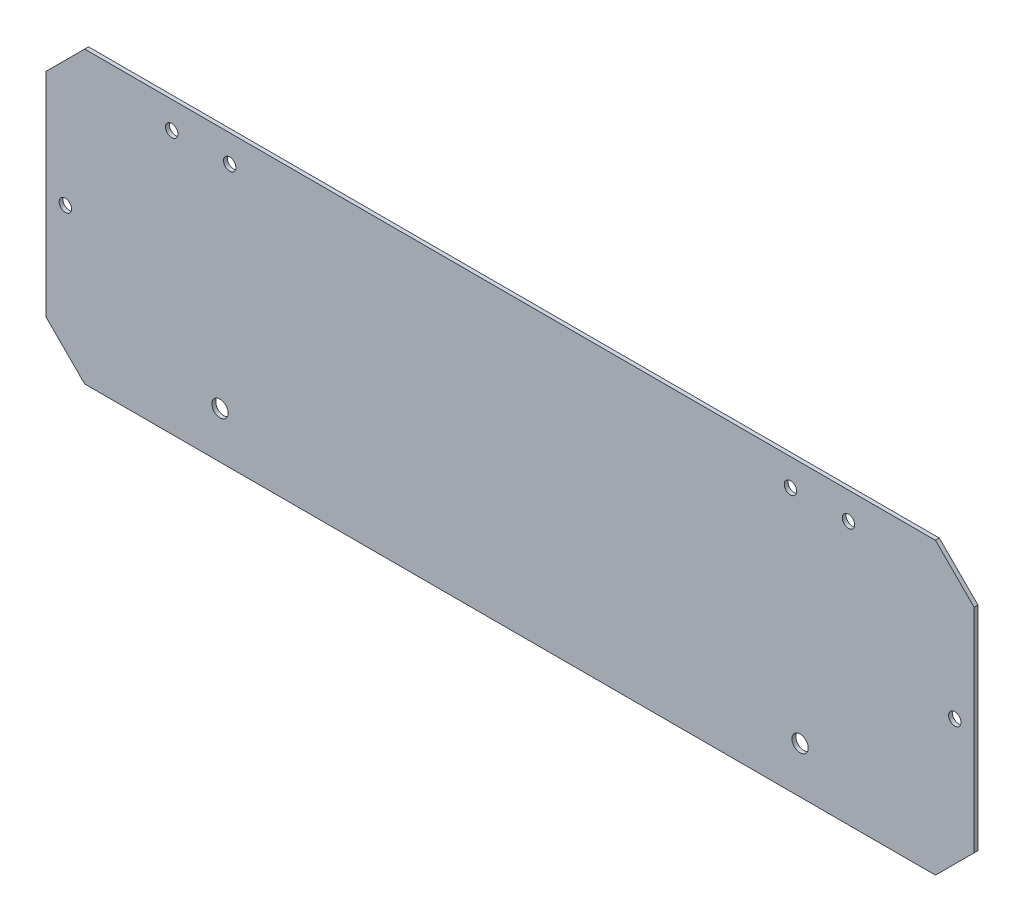
ISO-10303-21;
HEADER;
FILE_DESCRIPTION(('STEP AP214'),'2;1');
FILE_NAME('part.step','',(''),(''),'','','');
FILE_SCHEMA(('AUTOMOTIVE_DESIGN { 1 0 10303 214 1 1 1 1 }'));
ENDSEC;
DATA;
#1=APPLICATION_CONTEXT('core data for automotive mechanical design processes');
#2=APPLICATION_PROTOCOL_DEFINITION('international standard','automotive_design',2000,#1);
#3=PRODUCT_CONTEXT('',#1,'mechanical');
#4=PRODUCT('Part','Part','',(#3));
#5=PRODUCT_RELATED_PRODUCT_CATEGORY('part','',(#4));
#6=PRODUCT_DEFINITION_FORMATION('','',#4);
#7=PRODUCT_DEFINITION_CONTEXT('part definition',#1,'design');
#8=PRODUCT_DEFINITION('design','',#6,#7);
#9=PRODUCT_DEFINITION_SHAPE('','',#8);
#10=(LENGTH_UNIT() NAMED_UNIT(*) SI_UNIT(.MILLI.,.METRE.));
#11=(NAMED_UNIT(*) PLANE_ANGLE_UNIT() SI_UNIT($,.RADIAN.));
#12=(NAMED_UNIT(*) SI_UNIT($,.STERADIAN.) SOLID_ANGLE_UNIT());
#13=UNCERTAINTY_MEASURE_WITH_UNIT(LENGTH_MEASURE(1.E-05),#10,'distance_accuracy_value','');
#14=(GEOMETRIC_REPRESENTATION_CONTEXT(3) GLOBAL_UNCERTAINTY_ASSIGNED_CONTEXT((#13)) GLOBAL_UNIT_ASSIGNED_CONTEXT((#10,
#11,#12)) REPRESENTATION_CONTEXT('',''));
#15=CARTESIAN_POINT('',(0.,0.,0.));
#16=DIRECTION('',(0.,0.,1.));
#17=DIRECTION('',(1.,0.,0.));
#18=AXIS2_PLACEMENT_3D('',#15,#16,#17);
#19=CARTESIAN_POINT('',(0.,0.,1.));
#20=DIRECTION('',(1.,0.,0.));
#21=DIRECTION('',(0.,0.,-1.));
#22=AXIS2_PLACEMENT_3D('',#19,#20,#21);
#23=PLANE('',#22);
#24=DIRECTION('',(0.,-1.,0.));
#25=VECTOR('',#24,1.);
#26=CARTESIAN_POINT('',(0.,0.,0.));
#27=LINE('',#26,#25);
#28=CARTESIAN_POINT('',(0.,65.,0.));
#29=VERTEX_POINT('',#28);
#30=CARTESIAN_POINT('',(0.,10.,0.));
#31=VERTEX_POINT('',#30);
#32=EDGE_CURVE('E200',#29,#31,#27,.T.);
#33=ORIENTED_EDGE('',*,*,#32,.T.);
#34=DIRECTION('',(0.,0.,1.));
#35=VECTOR('',#34,1.);
#36=CARTESIAN_POINT('',(0.,10.,1.));
#37=LINE('',#36,#35);
#38=CARTESIAN_POINT('',(0.,10.,1.));
#39=VERTEX_POINT('',#38);
#40=EDGE_CURVE('E11',#31,#39,#37,.T.);
#41=ORIENTED_EDGE('',*,*,#40,.T.);
#42=DIRECTION('',(0.,-1.,0.));
#43=VECTOR('',#42,1.);
#44=CARTESIAN_POINT('',(0.,0.,1.));
#45=LINE('',#44,#43);
#46=CARTESIAN_POINT('',(0.,65.,1.));
#47=VERTEX_POINT('',#46);
#48=EDGE_CURVE('E146',#47,#39,#45,.T.);
#49=ORIENTED_EDGE('',*,*,#48,.F.);
#50=DIRECTION('',(0.,0.,-1.));
#51=VECTOR('',#50,1.);
#52=CARTESIAN_POINT('',(0.,65.,1.));
#53=LINE('',#52,#51);
#54=EDGE_CURVE('E62',#47,#29,#53,.T.);
#55=ORIENTED_EDGE('',*,*,#54,.T.);
#56=EDGE_LOOP('',(#33,#41,#49,#55));
#57=FACE_BOUND('',#56,.T.);
#58=ADVANCED_FACE('F51',(#57),#23,.F.);
#59=CARTESIAN_POINT('',(0.,0.,1.));
#60=DIRECTION('',(0.,1.,0.));
#61=DIRECTION('',(-1.,0.,0.));
#62=AXIS2_PLACEMENT_3D('',#59,#60,#61);
#63=PLANE('',#62);
#64=DIRECTION('',(1.,0.,0.));
#65=VECTOR('',#64,1.);
#66=CARTESIAN_POINT('',(0.,0.,0.));
#67=LINE('',#66,#65);
#68=CARTESIAN_POINT('',(10.,0.,0.));
#69=VERTEX_POINT('',#68);
#70=CARTESIAN_POINT('',(230.,0.,0.));
#71=VERTEX_POINT('',#70);
#72=EDGE_CURVE('E158',#69,#71,#67,.T.);
#73=ORIENTED_EDGE('',*,*,#72,.T.);
#74=DIRECTION('',(0.,0.,1.));
#75=VECTOR('',#74,1.);
#76=CARTESIAN_POINT('',(230.,0.,1.));
#77=LINE('',#76,#75);
#78=CARTESIAN_POINT('',(230.,0.,1.));
#79=VERTEX_POINT('',#78);
#80=EDGE_CURVE('E68',#71,#79,#77,.T.);
#81=ORIENTED_EDGE('',*,*,#80,.T.);
#82=DIRECTION('',(1.,0.,0.));
#83=VECTOR('',#82,1.);
#84=CARTESIAN_POINT('',(0.,0.,1.));
#85=LINE('',#84,#83);
#86=CARTESIAN_POINT('',(10.,0.,1.));
#87=VERTEX_POINT('',#86);
#88=EDGE_CURVE('E154',#87,#79,#85,.T.);
#89=ORIENTED_EDGE('',*,*,#88,.F.);
#90=DIRECTION('',(0.,0.,-1.));
#91=VECTOR('',#90,1.);
#92=CARTESIAN_POINT('',(10.,0.,1.));
#93=LINE('',#92,#91);
#94=EDGE_CURVE('E190',#87,#69,#93,.T.);
#95=ORIENTED_EDGE('',*,*,#94,.T.);
#96=EDGE_LOOP('',(#73,#81,#89,#95));
#97=FACE_BOUND('',#96,.T.);
#98=ADVANCED_FACE('F315',(#97),#63,.F.);
#99=CARTESIAN_POINT('',(240.,0.,1.));
#100=DIRECTION('',(-1.,0.,0.));
#101=DIRECTION('',(0.,-1.,0.));
#102=AXIS2_PLACEMENT_3D('',#99,#100,#101);
#103=PLANE('',#102);
#104=DIRECTION('',(0.,1.,0.));
#105=VECTOR('',#104,1.);
#106=CARTESIAN_POINT('',(240.,0.,0.));
#107=LINE('',#106,#105);
#108=CARTESIAN_POINT('',(240.,10.0000000000001,0.));
#109=VERTEX_POINT('',#108);
#110=CARTESIAN_POINT('',(240.,65.,0.));
#111=VERTEX_POINT('',#110);
#112=EDGE_CURVE('E149',#109,#111,#107,.T.);
#113=ORIENTED_EDGE('',*,*,#112,.T.);
#114=DIRECTION('',(0.,0.,1.));
#115=VECTOR('',#114,1.);
#116=CARTESIAN_POINT('',(240.,65.,1.));
#117=LINE('',#116,#115);
#118=CARTESIAN_POINT('',(240.,65.,1.));
#119=VERTEX_POINT('',#118);
#120=EDGE_CURVE('E122',#111,#119,#117,.T.);
#121=ORIENTED_EDGE('',*,*,#120,.T.);
#122=DIRECTION('',(0.,1.,0.));
#123=VECTOR('',#122,1.);
#124=CARTESIAN_POINT('',(240.,0.,1.));
#125=LINE('',#124,#123);
#126=CARTESIAN_POINT('',(240.,10.0000000000001,1.));
#127=VERTEX_POINT('',#126);
#128=EDGE_CURVE('E220',#127,#119,#125,.T.);
#129=ORIENTED_EDGE('',*,*,#128,.F.);
#130=DIRECTION('',(0.,0.,-1.));
#131=VECTOR('',#130,1.);
#132=CARTESIAN_POINT('',(240.,10.0000000000001,1.));
#133=LINE('',#132,#131);
#134=EDGE_CURVE('E128',#127,#109,#133,.T.);
#135=ORIENTED_EDGE('',*,*,#134,.T.);
#136=EDGE_LOOP('',(#113,#121,#129,#135));
#137=FACE_BOUND('',#136,.T.);
#138=ADVANCED_FACE('F310',(#137),#103,.F.);
#139=CARTESIAN_POINT('',(0.,75.,1.));
#140=DIRECTION('',(0.,-1.,0.));
#141=DIRECTION('',(1.,0.,0.));
#142=AXIS2_PLACEMENT_3D('',#139,#140,#141);
#143=PLANE('',#142);
#144=DIRECTION('',(-1.,0.,0.));
#145=VECTOR('',#144,1.);
#146=CARTESIAN_POINT('',(0.,75.,1.));
#147=LINE('',#146,#145);
#148=CARTESIAN_POINT('',(230.,75.,1.));
#149=VERTEX_POINT('',#148);
#150=CARTESIAN_POINT('',(10.,75.,1.));
#151=VERTEX_POINT('',#150);
#152=EDGE_CURVE('E139',#149,#151,#147,.T.);
#153=ORIENTED_EDGE('',*,*,#152,.F.);
#154=DIRECTION('',(0.,0.,-1.));
#155=VECTOR('',#154,1.);
#156=CARTESIAN_POINT('',(230.,75.,1.));
#157=LINE('',#156,#155);
#158=CARTESIAN_POINT('',(230.,75.,0.));
#159=VERTEX_POINT('',#158);
#160=EDGE_CURVE('E123',#149,#159,#157,.T.);
#161=ORIENTED_EDGE('',*,*,#160,.T.);
#162=DIRECTION('',(-1.,0.,0.));
#163=VECTOR('',#162,1.);
#164=CARTESIAN_POINT('',(0.,75.,0.));
#165=LINE('',#164,#163);
#166=CARTESIAN_POINT('',(10.,75.,0.));
#167=VERTEX_POINT('',#166);
#168=EDGE_CURVE('E140',#159,#167,#165,.T.);
#169=ORIENTED_EDGE('',*,*,#168,.T.);
#170=DIRECTION('',(0.,0.,1.));
#171=VECTOR('',#170,1.);
#172=CARTESIAN_POINT('',(10.,75.,1.));
#173=LINE('',#172,#171);
#174=EDGE_CURVE('E141',#167,#151,#173,.T.);
#175=ORIENTED_EDGE('',*,*,#174,.T.);
#176=EDGE_LOOP('',(#153,#161,#169,#175));
#177=FACE_BOUND('',#176,.T.);
#178=ADVANCED_FACE('F136',(#177),#143,.F.);
#179=CARTESIAN_POINT('',(0.,0.,1.));
#180=DIRECTION('',(0.,0.,-1.));
#181=DIRECTION('',(-1.,0.,0.));
#182=AXIS2_PLACEMENT_3D('',#179,#180,#181);
#183=PLANE('',#182);
#184=CARTESIAN_POINT('',(47.5,68.,0.999999999999999));
#185=DIRECTION('',(0.,0.,-1.));
#186=DIRECTION('',(-1.,0.,0.));
#187=AXIS2_PLACEMENT_3D('',#184,#185,#186);
#188=CIRCLE('',#187,1.59999999999999);
#189=CARTESIAN_POINT('',(45.9,68.,0.999999999999999));
#190=VERTEX_POINT('',#189);
#191=EDGE_CURVE('E202',#190,#190,#188,.T.);
#192=ORIENTED_EDGE('',*,*,#191,.T.);
#193=EDGE_LOOP('',(#192));
#194=FACE_BOUND('',#193,.T.);
#195=CARTESIAN_POINT('',(192.5,68.,0.999999999999999));
#196=DIRECTION('',(0.,0.,-1.));
#197=DIRECTION('',(-1.,0.,0.));
#198=AXIS2_PLACEMENT_3D('',#195,#196,#197);
#199=CIRCLE('',#198,1.59999999999999);
#200=CARTESIAN_POINT('',(190.9,68.,0.999999999999999));
#201=VERTEX_POINT('',#200);
#202=EDGE_CURVE('E215',#201,#201,#199,.T.);
#203=ORIENTED_EDGE('',*,*,#202,.T.);
#204=EDGE_LOOP('',(#203));
#205=FACE_BOUND('',#204,.T.);
#206=CARTESIAN_POINT('',(207.5,68.,0.999999999999999));
#207=DIRECTION('',(0.,0.,-1.));
#208=DIRECTION('',(-1.,0.,0.));
#209=AXIS2_PLACEMENT_3D('',#206,#207,#208);
#210=CIRCLE('',#209,1.59999999999999);
#211=CARTESIAN_POINT('',(205.9,68.,0.999999999999999));
#212=VERTEX_POINT('',#211);
#213=EDGE_CURVE('E223',#212,#212,#210,.T.);
#214=ORIENTED_EDGE('',*,*,#213,.T.);
#215=EDGE_LOOP('',(#214));
#216=FACE_BOUND('',#215,.T.);
#217=CARTESIAN_POINT('',(45.,12.,0.999999999999999));
#218=DIRECTION('',(0.,0.,-1.));
#219=DIRECTION('',(-1.,0.,0.));
#220=AXIS2_PLACEMENT_3D('',#217,#218,#219);
#221=CIRCLE('',#220,2.1);
#222=CARTESIAN_POINT('',(42.9,12.,0.999999999999999));
#223=VERTEX_POINT('',#222);
#224=EDGE_CURVE('E229',#223,#223,#221,.T.);
#225=ORIENTED_EDGE('',*,*,#224,.T.);
#226=EDGE_LOOP('',(#225));
#227=FACE_BOUND('',#226,.T.);
#228=CARTESIAN_POINT('',(32.5,68.,0.999999999999999));
#229=DIRECTION('',(0.,0.,-1.));
#230=DIRECTION('',(-1.,0.,0.));
#231=AXIS2_PLACEMENT_3D('',#228,#229,#230);
#232=CIRCLE('',#231,1.6);
#233=CARTESIAN_POINT('',(30.9,68.,0.999999999999999));
#234=VERTEX_POINT('',#233);
#235=EDGE_CURVE('E235',#234,#234,#232,.T.);
#236=ORIENTED_EDGE('',*,*,#235,.T.);
#237=EDGE_LOOP('',(#236));
#238=FACE_BOUND('',#237,.T.);
#239=CARTESIAN_POINT('',(235.,37.5,0.999999999999999));
#240=DIRECTION('',(0.,0.,-1.));
#241=DIRECTION('',(-1.,0.,0.));
#242=AXIS2_PLACEMENT_3D('',#239,#240,#241);
#243=CIRCLE('',#242,1.59999999999999);
#244=CARTESIAN_POINT('',(233.4,37.5,0.999999999999999));
#245=VERTEX_POINT('',#244);
#246=EDGE_CURVE('E237',#245,#245,#243,.T.);
#247=ORIENTED_EDGE('',*,*,#246,.T.);
#248=EDGE_LOOP('',(#247));
#249=FACE_BOUND('',#248,.T.);
#250=CARTESIAN_POINT('',(5.,37.5,0.999999999999999));
#251=DIRECTION('',(0.,0.,-1.));
#252=DIRECTION('',(-1.,0.,0.));
#253=AXIS2_PLACEMENT_3D('',#250,#251,#252);
#254=CIRCLE('',#253,1.6);
#255=CARTESIAN_POINT('',(3.4,37.5,0.999999999999999));
#256=VERTEX_POINT('',#255);
#257=EDGE_CURVE('E238',#256,#256,#254,.T.);
#258=ORIENTED_EDGE('',*,*,#257,.T.);
#259=EDGE_LOOP('',(#258));
#260=FACE_BOUND('',#259,.T.);
#261=CARTESIAN_POINT('',(195.,12.,0.999999999999999));
#262=DIRECTION('',(0.,0.,-1.));
#263=DIRECTION('',(-1.,0.,0.));
#264=AXIS2_PLACEMENT_3D('',#261,#262,#263);
#265=CIRCLE('',#264,2.09999999999999);
#266=CARTESIAN_POINT('',(192.9,12.,0.999999999999999));
#267=VERTEX_POINT('',#266);
#268=EDGE_CURVE('E244',#267,#267,#265,.T.);
#269=ORIENTED_EDGE('',*,*,#268,.T.);
#270=EDGE_LOOP('',(#269));
#271=FACE_BOUND('',#270,.T.);
#272=ORIENTED_EDGE('',*,*,#128,.T.);
#273=DIRECTION('',(0.707106781186548,-0.707106781186548,0.));
#274=VECTOR('',#273,1.);
#275=CARTESIAN_POINT('',(230.,75.,1.));
#276=LINE('',#275,#274);
#277=EDGE_CURVE('E184',#119,#149,#276,.F.);
#278=ORIENTED_EDGE('',*,*,#277,.T.);
#279=ORIENTED_EDGE('',*,*,#152,.T.);
#280=DIRECTION('',(0.707106781186548,0.707106781186548,0.));
#281=VECTOR('',#280,1.);
#282=CARTESIAN_POINT('',(0.,65.,1.));
#283=LINE('',#282,#281);
#284=EDGE_CURVE('E176',#151,#47,#283,.F.);
#285=ORIENTED_EDGE('',*,*,#284,.T.);
#286=ORIENTED_EDGE('',*,*,#48,.T.);
#287=DIRECTION('',(-0.707106781186548,0.707106781186548,0.));
#288=VECTOR('',#287,1.);
#289=CARTESIAN_POINT('',(10.,0.,1.));
#290=LINE('',#289,#288);
#291=EDGE_CURVE('E73',#39,#87,#290,.F.);
#292=ORIENTED_EDGE('',*,*,#291,.T.);
#293=ORIENTED_EDGE('',*,*,#88,.T.);
#294=DIRECTION('',(-0.707106781186548,-0.707106781186548,0.));
#295=VECTOR('',#294,1.);
#296=CARTESIAN_POINT('',(240.,10.0000000000001,1.));
#297=LINE('',#296,#295);
#298=EDGE_CURVE('E182',#79,#127,#297,.F.);
#299=ORIENTED_EDGE('',*,*,#298,.T.);
#300=EDGE_LOOP('',(#272,#278,#279,#285,#286,#292,#293,#299));
#301=FACE_BOUND('',#300,.T.);
#302=ADVANCED_FACE('F286',(#194,#205,#216,#227,#238,#249,#260,#271,#301),#183,.F.);
#303=CARTESIAN_POINT('',(0.,0.,0.));
#304=DIRECTION('',(0.,0.,-1.));
#305=DIRECTION('',(-1.,0.,0.));
#306=AXIS2_PLACEMENT_3D('',#303,#304,#305);
#307=PLANE('',#306);
#308=CARTESIAN_POINT('',(47.5,68.,0.));
#309=DIRECTION('',(0.,0.,-1.));
#310=DIRECTION('',(1.,0.,0.));
#311=AXIS2_PLACEMENT_3D('',#308,#309,#310);
#312=CIRCLE('',#311,1.59999999999999);
#313=CARTESIAN_POINT('',(49.1,68.,0.));
#314=VERTEX_POINT('',#313);
#315=EDGE_CURVE('E261',#314,#314,#312,.T.);
#316=ORIENTED_EDGE('',*,*,#315,.F.);
#317=EDGE_LOOP('',(#316));
#318=FACE_BOUND('',#317,.T.);
#319=CARTESIAN_POINT('',(192.5,68.,0.));
#320=DIRECTION('',(0.,0.,-1.));
#321=DIRECTION('',(-1.,0.,0.));
#322=AXIS2_PLACEMENT_3D('',#319,#320,#321);
#323=CIRCLE('',#322,1.59999999999999);
#324=CARTESIAN_POINT('',(190.9,68.,0.));
#325=VERTEX_POINT('',#324);
#326=EDGE_CURVE('E260',#325,#325,#323,.T.);
#327=ORIENTED_EDGE('',*,*,#326,.F.);
#328=EDGE_LOOP('',(#327));
#329=FACE_BOUND('',#328,.T.);
#330=CARTESIAN_POINT('',(207.5,68.,0.));
#331=DIRECTION('',(0.,0.,-1.));
#332=DIRECTION('',(-1.,0.,0.));
#333=AXIS2_PLACEMENT_3D('',#330,#331,#332);
#334=CIRCLE('',#333,1.59999999999999);
#335=CARTESIAN_POINT('',(205.9,68.,0.));
#336=VERTEX_POINT('',#335);
#337=EDGE_CURVE('E251',#336,#336,#334,.T.);
#338=ORIENTED_EDGE('',*,*,#337,.F.);
#339=EDGE_LOOP('',(#338));
#340=FACE_BOUND('',#339,.T.);
#341=CARTESIAN_POINT('',(45.,12.,0.));
#342=DIRECTION('',(0.,0.,-1.));
#343=DIRECTION('',(-1.,0.,0.));
#344=AXIS2_PLACEMENT_3D('',#341,#342,#343);
#345=CIRCLE('',#344,2.1);
#346=CARTESIAN_POINT('',(42.9,12.,0.));
#347=VERTEX_POINT('',#346);
#348=EDGE_CURVE('E252',#347,#347,#345,.T.);
#349=ORIENTED_EDGE('',*,*,#348,.F.);
#350=EDGE_LOOP('',(#349));
#351=FACE_BOUND('',#350,.T.);
#352=CARTESIAN_POINT('',(32.5,68.,0.));
#353=DIRECTION('',(0.,0.,-1.));
#354=DIRECTION('',(1.,0.,0.));
#355=AXIS2_PLACEMENT_3D('',#352,#353,#354);
#356=CIRCLE('',#355,1.6);
#357=CARTESIAN_POINT('',(34.1,68.,0.));
#358=VERTEX_POINT('',#357);
#359=EDGE_CURVE('E264',#358,#358,#356,.T.);
#360=ORIENTED_EDGE('',*,*,#359,.F.);
#361=EDGE_LOOP('',(#360));
#362=FACE_BOUND('',#361,.T.);
#363=CARTESIAN_POINT('',(235.,37.5,0.));
#364=DIRECTION('',(0.,0.,-1.));
#365=DIRECTION('',(-1.,0.,0.));
#366=AXIS2_PLACEMENT_3D('',#363,#364,#365);
#367=CIRCLE('',#366,1.59999999999999);
#368=CARTESIAN_POINT('',(233.4,37.5,0.));
#369=VERTEX_POINT('',#368);
#370=EDGE_CURVE('E272',#369,#369,#367,.T.);
#371=ORIENTED_EDGE('',*,*,#370,.F.);
#372=EDGE_LOOP('',(#371));
#373=FACE_BOUND('',#372,.T.);
#374=CARTESIAN_POINT('',(5.,37.5,0.));
#375=DIRECTION('',(0.,0.,-1.));
#376=DIRECTION('',(-1.,0.,0.));
#377=AXIS2_PLACEMENT_3D('',#374,#375,#376);
#378=CIRCLE('',#377,1.6);
#379=CARTESIAN_POINT('',(3.4,37.5,0.));
#380=VERTEX_POINT('',#379);
#381=EDGE_CURVE('E267',#380,#380,#378,.T.);
#382=ORIENTED_EDGE('',*,*,#381,.F.);
#383=EDGE_LOOP('',(#382));
#384=FACE_BOUND('',#383,.T.);
#385=CARTESIAN_POINT('',(195.,12.,0.));
#386=DIRECTION('',(0.,0.,-1.));
#387=DIRECTION('',(-1.,0.,0.));
#388=AXIS2_PLACEMENT_3D('',#385,#386,#387);
#389=CIRCLE('',#388,2.09999999999999);
#390=CARTESIAN_POINT('',(192.9,12.,0.));
#391=VERTEX_POINT('',#390);
#392=EDGE_CURVE('E248',#391,#391,#389,.T.);
#393=ORIENTED_EDGE('',*,*,#392,.F.);
#394=EDGE_LOOP('',(#393));
#395=FACE_BOUND('',#394,.T.);
#396=ORIENTED_EDGE('',*,*,#168,.F.);
#397=DIRECTION('',(-0.707106781186548,0.707106781186548,0.));
#398=VECTOR('',#397,1.);
#399=CARTESIAN_POINT('',(152.5,152.5,0.));
#400=LINE('',#399,#398);
#401=EDGE_CURVE('E119',#159,#111,#400,.F.);
#402=ORIENTED_EDGE('',*,*,#401,.T.);
#403=ORIENTED_EDGE('',*,*,#112,.F.);
#404=DIRECTION('',(0.707106781186548,0.707106781186548,0.));
#405=VECTOR('',#404,1.);
#406=CARTESIAN_POINT('',(115.,-115.,0.));
#407=LINE('',#406,#405);
#408=EDGE_CURVE('E132',#109,#71,#407,.F.);
#409=ORIENTED_EDGE('',*,*,#408,.T.);
#410=ORIENTED_EDGE('',*,*,#72,.F.);
#411=DIRECTION('',(0.707106781186548,-0.707106781186548,0.));
#412=VECTOR('',#411,1.);
#413=CARTESIAN_POINT('',(5.00000000000002,5.00000000000002,0.));
#414=LINE('',#413,#412);
#415=EDGE_CURVE('E167',#69,#31,#414,.F.);
#416=ORIENTED_EDGE('',*,*,#415,.T.);
#417=ORIENTED_EDGE('',*,*,#32,.F.);
#418=DIRECTION('',(-0.707106781186548,-0.707106781186548,0.));
#419=VECTOR('',#418,1.);
#420=CARTESIAN_POINT('',(-32.5,32.5,0.));
#421=LINE('',#420,#419);
#422=EDGE_CURVE('E142',#29,#167,#421,.F.);
#423=ORIENTED_EDGE('',*,*,#422,.T.);
#424=EDGE_LOOP('',(#396,#402,#403,#409,#410,#416,#417,#423));
#425=FACE_BOUND('',#424,.T.);
#426=ADVANCED_FACE('F144',(#318,#329,#340,#351,#362,#373,#384,#395,#425),#307,.T.);
#427=CARTESIAN_POINT('',(230.,75.,1.));
#428=DIRECTION('',(-0.707106781186547,-0.707106781186547,0.));
#429=DIRECTION('',(0.,0.,-1.));
#430=AXIS2_PLACEMENT_3D('',#427,#428,#429);
#431=PLANE('',#430);
#432=ORIENTED_EDGE('',*,*,#277,.F.);
#433=ORIENTED_EDGE('',*,*,#120,.F.);
#434=ORIENTED_EDGE('',*,*,#401,.F.);
#435=ORIENTED_EDGE('',*,*,#160,.F.);
#436=EDGE_LOOP('',(#432,#433,#434,#435));
#437=FACE_BOUND('',#436,.T.);
#438=ADVANCED_FACE('F125',(#437),#431,.F.);
#439=CARTESIAN_POINT('',(240.,10.0000000000001,1.));
#440=DIRECTION('',(-0.707106781186547,0.707106781186547,0.));
#441=DIRECTION('',(0.,0.,-1.));
#442=AXIS2_PLACEMENT_3D('',#439,#440,#441);
#443=PLANE('',#442);
#444=ORIENTED_EDGE('',*,*,#298,.F.);
#445=ORIENTED_EDGE('',*,*,#80,.F.);
#446=ORIENTED_EDGE('',*,*,#408,.F.);
#447=ORIENTED_EDGE('',*,*,#134,.F.);
#448=EDGE_LOOP('',(#444,#445,#446,#447));
#449=FACE_BOUND('',#448,.T.);
#450=ADVANCED_FACE('F313',(#449),#443,.F.);
#451=CARTESIAN_POINT('',(10.,0.,1.));
#452=DIRECTION('',(0.707106781186547,0.707106781186547,0.));
#453=DIRECTION('',(0.,0.,-1.));
#454=AXIS2_PLACEMENT_3D('',#451,#452,#453);
#455=PLANE('',#454);
#456=ORIENTED_EDGE('',*,*,#291,.F.);
#457=ORIENTED_EDGE('',*,*,#40,.F.);
#458=ORIENTED_EDGE('',*,*,#415,.F.);
#459=ORIENTED_EDGE('',*,*,#94,.F.);
#460=EDGE_LOOP('',(#456,#457,#458,#459));
#461=FACE_BOUND('',#460,.T.);
#462=ADVANCED_FACE('F312',(#461),#455,.F.);
#463=CARTESIAN_POINT('',(0.,65.,1.));
#464=DIRECTION('',(0.707106781186547,-0.707106781186547,0.));
#465=DIRECTION('',(0.,0.,-1.));
#466=AXIS2_PLACEMENT_3D('',#463,#464,#465);
#467=PLANE('',#466);
#468=ORIENTED_EDGE('',*,*,#284,.F.);
#469=ORIENTED_EDGE('',*,*,#174,.F.);
#470=ORIENTED_EDGE('',*,*,#422,.F.);
#471=ORIENTED_EDGE('',*,*,#54,.F.);
#472=EDGE_LOOP('',(#468,#469,#470,#471));
#473=FACE_BOUND('',#472,.T.);
#474=ADVANCED_FACE('F53',(#473),#467,.F.);
#475=CARTESIAN_POINT('',(195.,12.,10.));
#476=DIRECTION('',(0.,0.,-1.));
#477=DIRECTION('',(-1.,0.,0.));
#478=AXIS2_PLACEMENT_3D('',#475,#476,#477);
#479=CYLINDRICAL_SURFACE('',#478,2.09999999999999);
#480=ORIENTED_EDGE('',*,*,#392,.T.);
#481=EDGE_LOOP('',(#480));
#482=FACE_BOUND('',#481,.T.);
#483=ORIENTED_EDGE('',*,*,#268,.F.);
#484=EDGE_LOOP('',(#483));
#485=FACE_BOUND('',#484,.T.);
#486=ADVANCED_FACE('F293',(#482,#485),#479,.F.);
#487=CARTESIAN_POINT('',(5.,37.5,10.));
#488=DIRECTION('',(0.,0.,-1.));
#489=DIRECTION('',(-1.,0.,0.));
#490=AXIS2_PLACEMENT_3D('',#487,#488,#489);
#491=CYLINDRICAL_SURFACE('',#490,1.6);
#492=ORIENTED_EDGE('',*,*,#381,.T.);
#493=EDGE_LOOP('',(#492));
#494=FACE_BOUND('',#493,.T.);
#495=ORIENTED_EDGE('',*,*,#257,.F.);
#496=EDGE_LOOP('',(#495));
#497=FACE_BOUND('',#496,.T.);
#498=ADVANCED_FACE('F298',(#494,#497),#491,.F.);
#499=CARTESIAN_POINT('',(235.,37.5,10.));
#500=DIRECTION('',(0.,0.,-1.));
#501=DIRECTION('',(-1.,0.,0.));
#502=AXIS2_PLACEMENT_3D('',#499,#500,#501);
#503=CYLINDRICAL_SURFACE('',#502,1.59999999999999);
#504=ORIENTED_EDGE('',*,*,#370,.T.);
#505=EDGE_LOOP('',(#504));
#506=FACE_BOUND('',#505,.T.);
#507=ORIENTED_EDGE('',*,*,#246,.F.);
#508=EDGE_LOOP('',(#507));
#509=FACE_BOUND('',#508,.T.);
#510=ADVANCED_FACE('F381',(#506,#509),#503,.F.);
#511=CARTESIAN_POINT('',(32.5,68.,10.));
#512=DIRECTION('',(0.,0.,-1.));
#513=DIRECTION('',(-1.,0.,0.));
#514=AXIS2_PLACEMENT_3D('',#511,#512,#513);
#515=CYLINDRICAL_SURFACE('',#514,1.6);
#516=ORIENTED_EDGE('',*,*,#359,.T.);
#517=EDGE_LOOP('',(#516));
#518=FACE_BOUND('',#517,.T.);
#519=ORIENTED_EDGE('',*,*,#235,.F.);
#520=EDGE_LOOP('',(#519));
#521=FACE_BOUND('',#520,.T.);
#522=ADVANCED_FACE('F282',(#518,#521),#515,.F.);
#523=CARTESIAN_POINT('',(45.,12.,10.));
#524=DIRECTION('',(0.,0.,-1.));
#525=DIRECTION('',(-1.,0.,0.));
#526=AXIS2_PLACEMENT_3D('',#523,#524,#525);
#527=CYLINDRICAL_SURFACE('',#526,2.1);
#528=ORIENTED_EDGE('',*,*,#348,.T.);
#529=EDGE_LOOP('',(#528));
#530=FACE_BOUND('',#529,.T.);
#531=ORIENTED_EDGE('',*,*,#224,.F.);
#532=EDGE_LOOP('',(#531));
#533=FACE_BOUND('',#532,.T.);
#534=ADVANCED_FACE('F399',(#530,#533),#527,.F.);
#535=CARTESIAN_POINT('',(207.5,68.,10.));
#536=DIRECTION('',(0.,0.,-1.));
#537=DIRECTION('',(-1.,0.,0.));
#538=AXIS2_PLACEMENT_3D('',#535,#536,#537);
#539=CYLINDRICAL_SURFACE('',#538,1.59999999999999);
#540=ORIENTED_EDGE('',*,*,#337,.T.);
#541=EDGE_LOOP('',(#540));
#542=FACE_BOUND('',#541,.T.);
#543=ORIENTED_EDGE('',*,*,#213,.F.);
#544=EDGE_LOOP('',(#543));
#545=FACE_BOUND('',#544,.T.);
#546=ADVANCED_FACE('F409',(#542,#545),#539,.F.);
#547=CARTESIAN_POINT('',(192.5,68.,10.));
#548=DIRECTION('',(0.,0.,-1.));
#549=DIRECTION('',(-1.,0.,0.));
#550=AXIS2_PLACEMENT_3D('',#547,#548,#549);
#551=CYLINDRICAL_SURFACE('',#550,1.59999999999999);
#552=ORIENTED_EDGE('',*,*,#326,.T.);
#553=EDGE_LOOP('',(#552));
#554=FACE_BOUND('',#553,.T.);
#555=ORIENTED_EDGE('',*,*,#202,.F.);
#556=EDGE_LOOP('',(#555));
#557=FACE_BOUND('',#556,.T.);
#558=ADVANCED_FACE('F420',(#554,#557),#551,.F.);
#559=CARTESIAN_POINT('',(47.5,68.,10.));
#560=DIRECTION('',(0.,0.,-1.));
#561=DIRECTION('',(-1.,0.,0.));
#562=AXIS2_PLACEMENT_3D('',#559,#560,#561);
#563=CYLINDRICAL_SURFACE('',#562,1.59999999999999);
#564=ORIENTED_EDGE('',*,*,#315,.T.);
#565=EDGE_LOOP('',(#564));
#566=FACE_BOUND('',#565,.T.);
#567=ORIENTED_EDGE('',*,*,#191,.F.);
#568=EDGE_LOOP('',(#567));
#569=FACE_BOUND('',#568,.T.);
#570=ADVANCED_FACE('F427',(#566,#569),#563,.F.);
#571=CLOSED_SHELL('',(#58,#98,#138,#178,#302,#426,#438,#450,#462,#474,#486,#498,#510,#522,#534,
#546,#558,#570));
#572=MANIFOLD_SOLID_BREP('B2',#571);
#573=ADVANCED_BREP_SHAPE_REPRESENTATION('',(#18,#572),#14);
#574=SHAPE_DEFINITION_REPRESENTATION(#9,#573);
ENDSEC;
END-ISO-10303-21;
